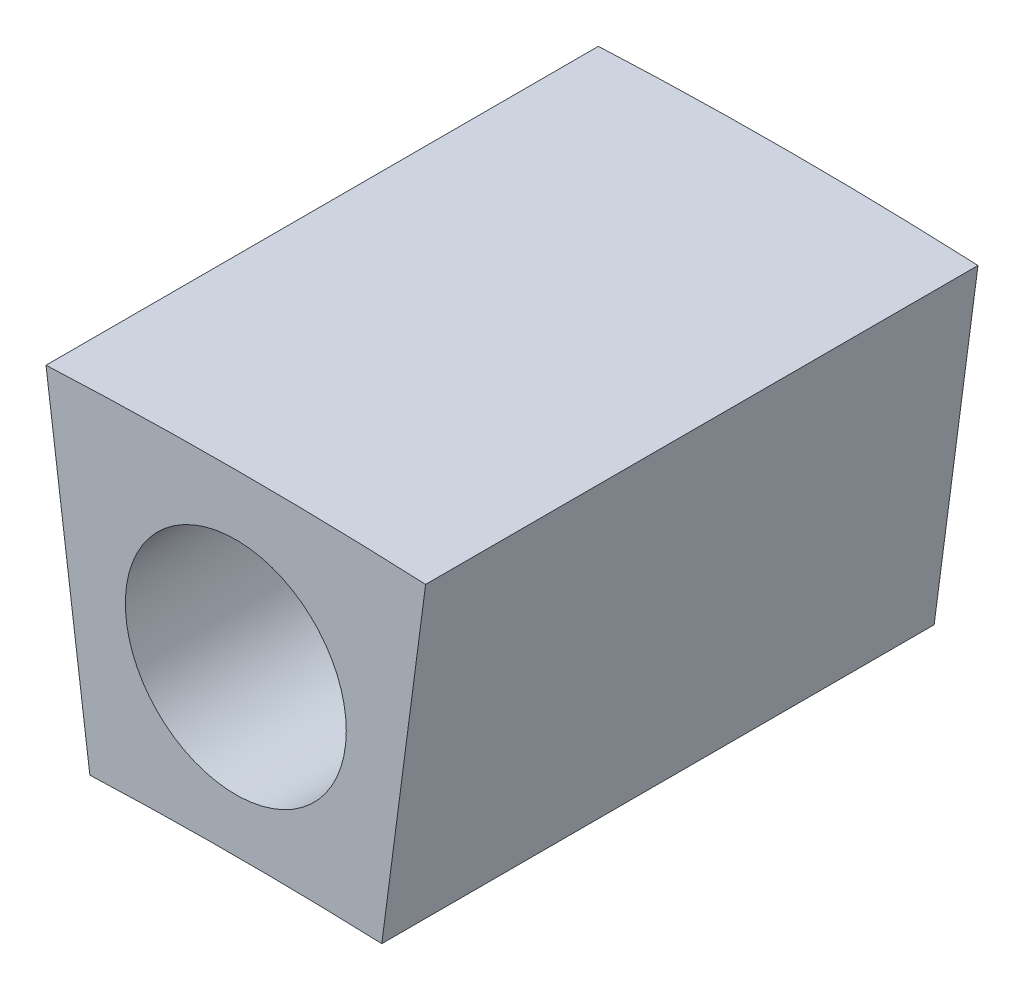
ISO-10303-21;
HEADER;
FILE_DESCRIPTION(('STEP AP214'),'2;1');
FILE_NAME('part.step','',(''),(''),'','','');
FILE_SCHEMA(('AUTOMOTIVE_DESIGN { 1 0 10303 214 1 1 1 1 }'));
ENDSEC;
DATA;
#1=APPLICATION_CONTEXT('core data for automotive mechanical design processes');
#2=APPLICATION_PROTOCOL_DEFINITION('international standard','automotive_design',2000,#1);
#3=PRODUCT_CONTEXT('',#1,'mechanical');
#4=PRODUCT('Part','Part','',(#3));
#5=PRODUCT_RELATED_PRODUCT_CATEGORY('part','',(#4));
#6=PRODUCT_DEFINITION_FORMATION('','',#4);
#7=PRODUCT_DEFINITION_CONTEXT('part definition',#1,'design');
#8=PRODUCT_DEFINITION('design','',#6,#7);
#9=PRODUCT_DEFINITION_SHAPE('','',#8);
#10=(LENGTH_UNIT() NAMED_UNIT(*) SI_UNIT(.MILLI.,.METRE.));
#11=(NAMED_UNIT(*) PLANE_ANGLE_UNIT() SI_UNIT($,.RADIAN.));
#12=(NAMED_UNIT(*) SI_UNIT($,.STERADIAN.) SOLID_ANGLE_UNIT());
#13=UNCERTAINTY_MEASURE_WITH_UNIT(LENGTH_MEASURE(1.E-05),#10,'distance_accuracy_value','');
#14=(GEOMETRIC_REPRESENTATION_CONTEXT(3) GLOBAL_UNCERTAINTY_ASSIGNED_CONTEXT((#13)) GLOBAL_UNIT_ASSIGNED_CONTEXT((#10,
#11,#12)) REPRESENTATION_CONTEXT('',''));
#15=CARTESIAN_POINT('',(0.,0.,0.));
#16=DIRECTION('',(0.,0.,1.));
#17=DIRECTION('',(1.,0.,0.));
#18=AXIS2_PLACEMENT_3D('',#15,#16,#17);
#19=CARTESIAN_POINT('',(3.96357515138866,-3.92225559208893,7.5));
#20=DIRECTION('',(-0.991444861373811,0.130526192220045,0.));
#21=DIRECTION('',(-0.130526192220045,-0.991444861373811,0.));
#22=AXIS2_PLACEMENT_3D('',#19,#20,#21);
#23=PLANE('',#22);
#24=DIRECTION('',(0.130526192220045,0.991444861373811,0.));
#25=VECTOR('',#24,1.);
#26=CARTESIAN_POINT('',(3.96357515138866,-3.92225559208893,-7.5));
#27=LINE('',#26,#25);
#28=CARTESIAN_POINT('',(3.96357515138865,-3.92225559208893,-7.5));
#29=VERTEX_POINT('',#28);
#30=CARTESIAN_POINT('',(5.15440637664515,5.1230055847151,-7.5));
#31=VERTEX_POINT('',#30);
#32=EDGE_CURVE('E96',#29,#31,#27,.T.);
#33=ORIENTED_EDGE('',*,*,#32,.T.);
#34=DIRECTION('',(0.,0.,-1.));
#35=VECTOR('',#34,1.);
#36=CARTESIAN_POINT('',(5.15440637664515,5.1230055847151,7.5));
#37=LINE('',#36,#35);
#38=CARTESIAN_POINT('',(5.15440637664515,5.1230055847151,7.5));
#39=VERTEX_POINT('',#38);
#40=EDGE_CURVE('E11',#39,#31,#37,.T.);
#41=ORIENTED_EDGE('',*,*,#40,.F.);
#42=DIRECTION('',(0.130526192220045,0.991444861373811,0.));
#43=VECTOR('',#42,1.);
#44=CARTESIAN_POINT('',(3.96357515138866,-3.92225559208893,7.5));
#45=LINE('',#44,#43);
#46=CARTESIAN_POINT('',(3.96357515138865,-3.92225559208893,7.5));
#47=VERTEX_POINT('',#46);
#48=EDGE_CURVE('E82',#47,#39,#45,.T.);
#49=ORIENTED_EDGE('',*,*,#48,.F.);
#50=DIRECTION('',(0.,0.,-1.));
#51=VECTOR('',#50,1.);
#52=CARTESIAN_POINT('',(3.96357515138865,-3.92225559208893,7.5));
#53=LINE('',#52,#51);
#54=EDGE_CURVE('E49',#47,#29,#53,.T.);
#55=ORIENTED_EDGE('',*,*,#54,.T.);
#56=EDGE_LOOP('',(#33,#41,#49,#55));
#57=FACE_BOUND('',#56,.T.);
#58=ADVANCED_FACE('F33',(#57),#23,.F.);
#59=CARTESIAN_POINT('',(7.78414437929763E-13,-107.305065620244,7.5));
#60=DIRECTION('',(0.,0.,-1.));
#61=DIRECTION('',(-1.,0.,0.));
#62=AXIS2_PLACEMENT_3D('',#59,#60,#61);
#63=CYLINDRICAL_SURFACE('',#62,112.546164305866);
#64=CARTESIAN_POINT('',(7.78414437929763E-13,-107.305065620244,-7.5));
#65=DIRECTION('',(0.,0.,1.));
#66=DIRECTION('',(1.,0.,0.));
#67=AXIS2_PLACEMENT_3D('',#64,#65,#66);
#68=CIRCLE('',#67,112.546164305866);
#69=CARTESIAN_POINT('',(-5.15440637664396,5.12300558471508,-7.5));
#70=VERTEX_POINT('',#69);
#71=EDGE_CURVE('E87',#31,#70,#68,.T.);
#72=ORIENTED_EDGE('',*,*,#71,.T.);
#73=DIRECTION('',(0.,0.,-1.));
#74=VECTOR('',#73,1.);
#75=CARTESIAN_POINT('',(-5.15440637664396,5.12300558471508,7.5));
#76=LINE('',#75,#74);
#77=CARTESIAN_POINT('',(-5.15440637664396,5.12300558471508,7.5));
#78=VERTEX_POINT('',#77);
#79=EDGE_CURVE('E41',#78,#70,#76,.T.);
#80=ORIENTED_EDGE('',*,*,#79,.F.);
#81=CARTESIAN_POINT('',(7.78414437929763E-13,-107.305065620244,7.5));
#82=DIRECTION('',(0.,0.,1.));
#83=DIRECTION('',(1.,0.,0.));
#84=AXIS2_PLACEMENT_3D('',#81,#82,#83);
#85=CIRCLE('',#84,112.546164305866);
#86=EDGE_CURVE('E75',#39,#78,#85,.T.);
#87=ORIENTED_EDGE('',*,*,#86,.F.);
#88=ORIENTED_EDGE('',*,*,#40,.T.);
#89=EDGE_LOOP('',(#72,#80,#87,#88));
#90=FACE_BOUND('',#89,.T.);
#91=ADVANCED_FACE('F86',(#90),#63,.T.);
#92=CARTESIAN_POINT('',(-5.15440637664395,5.12300558471508,7.5));
#93=DIRECTION('',(0.991444861373812,0.130526192220043,0.));
#94=DIRECTION('',(-0.130526192220043,0.991444861373812,0.));
#95=AXIS2_PLACEMENT_3D('',#92,#93,#94);
#96=PLANE('',#95);
#97=DIRECTION('',(0.130526192220043,-0.991444861373812,0.));
#98=VECTOR('',#97,1.);
#99=CARTESIAN_POINT('',(-5.15440637664395,5.12300558471508,-7.5));
#100=LINE('',#99,#98);
#101=CARTESIAN_POINT('',(-3.96357515138747,-3.92225559208895,-7.5));
#102=VERTEX_POINT('',#101);
#103=EDGE_CURVE('E100',#70,#102,#100,.T.);
#104=ORIENTED_EDGE('',*,*,#103,.T.);
#105=DIRECTION('',(0.,0.,-1.));
#106=VECTOR('',#105,1.);
#107=CARTESIAN_POINT('',(-3.96357515138747,-3.92225559208895,7.5));
#108=LINE('',#107,#106);
#109=CARTESIAN_POINT('',(-3.96357515138747,-3.92225559208895,7.5));
#110=VERTEX_POINT('',#109);
#111=EDGE_CURVE('E64',#110,#102,#108,.T.);
#112=ORIENTED_EDGE('',*,*,#111,.F.);
#113=DIRECTION('',(0.130526192220043,-0.991444861373812,0.));
#114=VECTOR('',#113,1.);
#115=CARTESIAN_POINT('',(-5.15440637664395,5.12300558471508,7.5));
#116=LINE('',#115,#114);
#117=EDGE_CURVE('E81',#78,#110,#116,.T.);
#118=ORIENTED_EDGE('',*,*,#117,.F.);
#119=ORIENTED_EDGE('',*,*,#79,.T.);
#120=EDGE_LOOP('',(#104,#112,#118,#119));
#121=FACE_BOUND('',#120,.T.);
#122=ADVANCED_FACE('F90',(#121),#96,.F.);
#123=CARTESIAN_POINT('',(7.02069257752024E-13,-107.550660543064,7.5));
#124=DIRECTION('',(0.,0.,-1.));
#125=DIRECTION('',(-1.,0.,0.));
#126=AXIS2_PLACEMENT_3D('',#123,#124,#125);
#127=CYLINDRICAL_SURFACE('',#126,103.704176582546);
#128=CARTESIAN_POINT('',(7.02069257752024E-13,-107.550660543064,-7.5));
#129=DIRECTION('',(0.,0.,1.));
#130=DIRECTION('',(1.,0.,0.));
#131=AXIS2_PLACEMENT_3D('',#128,#129,#130);
#132=CIRCLE('',#131,103.704176582546);
#133=EDGE_CURVE('E102',#29,#102,#132,.T.);
#134=ORIENTED_EDGE('',*,*,#133,.F.);
#135=ORIENTED_EDGE('',*,*,#54,.F.);
#136=CARTESIAN_POINT('',(7.02069257752024E-13,-107.550660543064,7.5));
#137=DIRECTION('',(0.,0.,1.));
#138=DIRECTION('',(1.,0.,0.));
#139=AXIS2_PLACEMENT_3D('',#136,#137,#138);
#140=CIRCLE('',#139,103.704176582546);
#141=EDGE_CURVE('E91',#47,#110,#140,.T.);
#142=ORIENTED_EDGE('',*,*,#141,.T.);
#143=ORIENTED_EDGE('',*,*,#111,.T.);
#144=EDGE_LOOP('',(#134,#135,#142,#143));
#145=FACE_BOUND('',#144,.T.);
#146=ADVANCED_FACE('F123',(#145),#127,.F.);
#147=CARTESIAN_POINT('',(7.78414437929763E-13,-107.305065620244,7.5));
#148=DIRECTION('',(0.,0.,1.));
#149=DIRECTION('',(1.,0.,0.));
#150=AXIS2_PLACEMENT_3D('',#147,#148,#149);
#151=PLANE('',#150);
#152=CARTESIAN_POINT('',(5.95010152260045E-13,0.600374996313075,7.5));
#153=DIRECTION('',(0.,0.,1.));
#154=DIRECTION('',(1.,0.,0.));
#155=AXIS2_PLACEMENT_3D('',#152,#153,#154);
#156=CIRCLE('',#155,3.);
#157=CARTESIAN_POINT('',(3.0000000000006,0.600374996313075,7.5));
#158=VERTEX_POINT('',#157);
#159=EDGE_CURVE('E108',#158,#158,#156,.T.);
#160=ORIENTED_EDGE('',*,*,#159,.F.);
#161=EDGE_LOOP('',(#160));
#162=FACE_BOUND('',#161,.T.);
#163=ORIENTED_EDGE('',*,*,#48,.T.);
#164=ORIENTED_EDGE('',*,*,#86,.T.);
#165=ORIENTED_EDGE('',*,*,#117,.T.);
#166=ORIENTED_EDGE('',*,*,#141,.F.);
#167=EDGE_LOOP('',(#163,#164,#165,#166));
#168=FACE_BOUND('',#167,.T.);
#169=ADVANCED_FACE('F78',(#162,#168),#151,.T.);
#170=CARTESIAN_POINT('',(7.78414437929763E-13,-107.305065620244,-7.5));
#171=DIRECTION('',(0.,0.,1.));
#172=DIRECTION('',(1.,0.,0.));
#173=AXIS2_PLACEMENT_3D('',#170,#171,#172);
#174=PLANE('',#173);
#175=CARTESIAN_POINT('',(5.95010152260045E-13,0.600374996313075,-7.5));
#176=DIRECTION('',(0.,0.,1.));
#177=DIRECTION('',(1.,0.,0.));
#178=AXIS2_PLACEMENT_3D('',#175,#176,#177);
#179=CIRCLE('',#178,3.);
#180=CARTESIAN_POINT('',(3.0000000000006,0.600374996313075,-7.5));
#181=VERTEX_POINT('',#180);
#182=EDGE_CURVE('E98',#181,#181,#179,.T.);
#183=ORIENTED_EDGE('',*,*,#182,.T.);
#184=EDGE_LOOP('',(#183));
#185=FACE_BOUND('',#184,.T.);
#186=ORIENTED_EDGE('',*,*,#32,.F.);
#187=ORIENTED_EDGE('',*,*,#133,.T.);
#188=ORIENTED_EDGE('',*,*,#103,.F.);
#189=ORIENTED_EDGE('',*,*,#71,.F.);
#190=EDGE_LOOP('',(#186,#187,#188,#189));
#191=FACE_BOUND('',#190,.T.);
#192=ADVANCED_FACE('F114',(#185,#191),#174,.F.);
#193=CARTESIAN_POINT('',(5.95010152260045E-13,0.600374996313075,-7.5));
#194=DIRECTION('',(0.,0.,1.));
#195=DIRECTION('',(1.,0.,0.));
#196=AXIS2_PLACEMENT_3D('',#193,#194,#195);
#197=CYLINDRICAL_SURFACE('',#196,3.);
#198=ORIENTED_EDGE('',*,*,#182,.F.);
#199=EDGE_LOOP('',(#198));
#200=FACE_BOUND('',#199,.T.);
#201=ORIENTED_EDGE('',*,*,#159,.T.);
#202=EDGE_LOOP('',(#201));
#203=FACE_BOUND('',#202,.T.);
#204=ADVANCED_FACE('F116',(#200,#203),#197,.F.);
#205=CLOSED_SHELL('',(#58,#91,#122,#146,#169,#192,#204));
#206=MANIFOLD_SOLID_BREP('B2',#205);
#207=ADVANCED_BREP_SHAPE_REPRESENTATION('',(#18,#206),#14);
#208=SHAPE_DEFINITION_REPRESENTATION(#9,#207);
ENDSEC;
END-ISO-10303-21;
